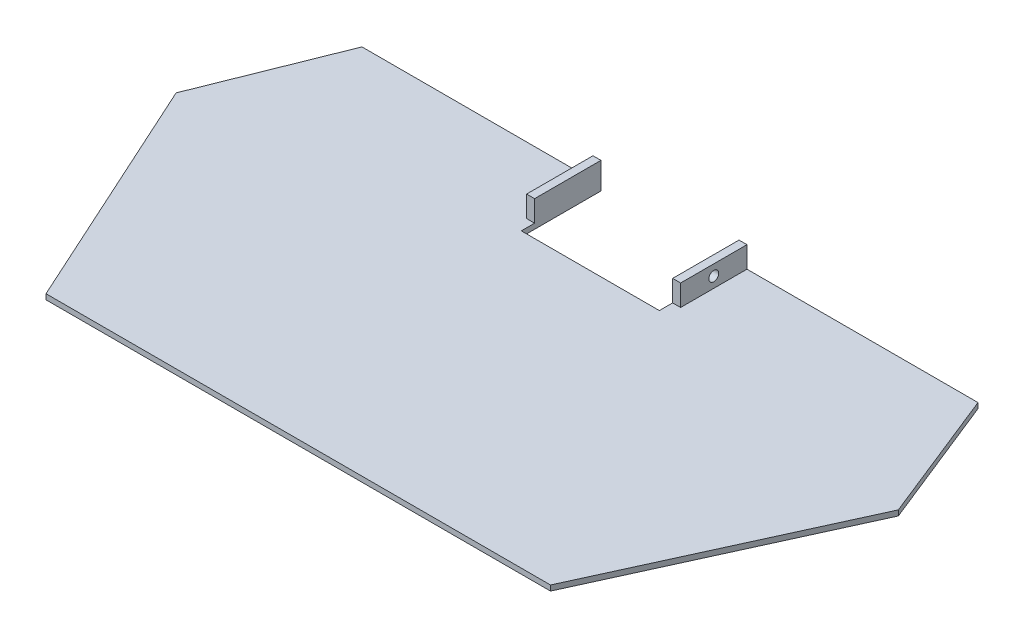
ISO-10303-21;
HEADER;
FILE_DESCRIPTION(('STEP AP214'),'2;1');
FILE_NAME('part.step','',(''),(''),'','','');
FILE_SCHEMA(('AUTOMOTIVE_DESIGN { 1 0 10303 214 1 1 1 1 }'));
ENDSEC;
DATA;
#1=APPLICATION_CONTEXT('core data for automotive mechanical design processes');
#2=APPLICATION_PROTOCOL_DEFINITION('international standard','automotive_design',2000,#1);
#3=PRODUCT_CONTEXT('',#1,'mechanical');
#4=PRODUCT('Part','Part','',(#3));
#5=PRODUCT_RELATED_PRODUCT_CATEGORY('part','',(#4));
#6=PRODUCT_DEFINITION_FORMATION('','',#4);
#7=PRODUCT_DEFINITION_CONTEXT('part definition',#1,'design');
#8=PRODUCT_DEFINITION('design','',#6,#7);
#9=PRODUCT_DEFINITION_SHAPE('','',#8);
#10=(LENGTH_UNIT() NAMED_UNIT(*) SI_UNIT(.MILLI.,.METRE.));
#11=(NAMED_UNIT(*) PLANE_ANGLE_UNIT() SI_UNIT($,.RADIAN.));
#12=(NAMED_UNIT(*) SI_UNIT($,.STERADIAN.) SOLID_ANGLE_UNIT());
#13=UNCERTAINTY_MEASURE_WITH_UNIT(LENGTH_MEASURE(1.E-05),#10,'distance_accuracy_value','');
#14=(GEOMETRIC_REPRESENTATION_CONTEXT(3) GLOBAL_UNCERTAINTY_ASSIGNED_CONTEXT((#13)) GLOBAL_UNIT_ASSIGNED_CONTEXT((#10,
#11,#12)) REPRESENTATION_CONTEXT('',''));
#15=CARTESIAN_POINT('',(0.,0.,0.));
#16=DIRECTION('',(0.,0.,1.));
#17=DIRECTION('',(1.,0.,0.));
#18=AXIS2_PLACEMENT_3D('',#15,#16,#17);
#19=CARTESIAN_POINT('',(0.,2.,0.));
#20=DIRECTION('',(0.,1.,0.));
#21=DIRECTION('',(0.,0.,1.));
#22=AXIS2_PLACEMENT_3D('',#19,#20,#21);
#23=PLANE('',#22);
#24=DIRECTION('',(0.,0.,-1.));
#25=VECTOR('',#24,1.);
#26=CARTESIAN_POINT('',(29.,2.,-60.));
#27=LINE('',#26,#25);
#28=CARTESIAN_POINT('',(29.,2.,-35.));
#29=VERTEX_POINT('',#28);
#30=CARTESIAN_POINT('',(29.,2.,-60.));
#31=VERTEX_POINT('',#30);
#32=EDGE_CURVE('E153',#29,#31,#27,.T.);
#33=ORIENTED_EDGE('',*,*,#32,.F.);
#34=DIRECTION('',(1.,0.,0.));
#35=VECTOR('',#34,1.);
#36=CARTESIAN_POINT('',(26.,2.,-35.));
#37=LINE('',#36,#35);
#38=CARTESIAN_POINT('',(26.,2.,-35.));
#39=VERTEX_POINT('',#38);
#40=EDGE_CURVE('E160',#39,#29,#37,.T.);
#41=ORIENTED_EDGE('',*,*,#40,.F.);
#42=DIRECTION('',(0.,0.,1.));
#43=VECTOR('',#42,1.);
#44=CARTESIAN_POINT('',(26.,2.,-30.));
#45=LINE('',#44,#43);
#46=CARTESIAN_POINT('',(26.,2.,-30.));
#47=VERTEX_POINT('',#46);
#48=EDGE_CURVE('E173',#39,#47,#45,.T.);
#49=ORIENTED_EDGE('',*,*,#48,.T.);
#50=DIRECTION('',(-1.,0.,0.));
#51=VECTOR('',#50,1.);
#52=CARTESIAN_POINT('',(26.,2.,-30.));
#53=LINE('',#52,#51);
#54=CARTESIAN_POINT('',(-26.,2.,-30.));
#55=VERTEX_POINT('',#54);
#56=EDGE_CURVE('E175',#47,#55,#53,.T.);
#57=ORIENTED_EDGE('',*,*,#56,.T.);
#58=DIRECTION('',(0.,0.,-1.));
#59=VECTOR('',#58,1.);
#60=CARTESIAN_POINT('',(-26.,2.,-30.));
#61=LINE('',#60,#59);
#62=CARTESIAN_POINT('',(-26.,2.,-35.));
#63=VERTEX_POINT('',#62);
#64=EDGE_CURVE('E182',#55,#63,#61,.T.);
#65=ORIENTED_EDGE('',*,*,#64,.T.);
#66=DIRECTION('',(1.,0.,0.));
#67=VECTOR('',#66,1.);
#68=CARTESIAN_POINT('',(-26.,2.,-35.));
#69=LINE('',#68,#67);
#70=CARTESIAN_POINT('',(-29.,2.,-35.));
#71=VERTEX_POINT('',#70);
#72=EDGE_CURVE('E265',#71,#63,#69,.T.);
#73=ORIENTED_EDGE('',*,*,#72,.F.);
#74=DIRECTION('',(0.,0.,1.));
#75=VECTOR('',#74,1.);
#76=CARTESIAN_POINT('',(-29.,2.,-60.));
#77=LINE('',#76,#75);
#78=CARTESIAN_POINT('',(-29.,2.,-60.));
#79=VERTEX_POINT('',#78);
#80=EDGE_CURVE('E63',#79,#71,#77,.T.);
#81=ORIENTED_EDGE('',*,*,#80,.F.);
#82=DIRECTION('',(-1.,0.,0.));
#83=VECTOR('',#82,1.);
#84=CARTESIAN_POINT('',(-26.,2.,-60.));
#85=LINE('',#84,#83);
#86=CARTESIAN_POINT('',(-116.,2.,-60.));
#87=VERTEX_POINT('',#86);
#88=EDGE_CURVE('E184',#79,#87,#85,.T.);
#89=ORIENTED_EDGE('',*,*,#88,.T.);
#90=DIRECTION('',(-0.371390676354104,0.,0.928476690885259));
#91=VECTOR('',#90,1.);
#92=CARTESIAN_POINT('',(-116.,2.,-60.));
#93=LINE('',#92,#91);
#94=CARTESIAN_POINT('',(-136.,2.,-9.99999999999998));
#95=VERTEX_POINT('',#94);
#96=EDGE_CURVE('E186',#87,#95,#93,.T.);
#97=ORIENTED_EDGE('',*,*,#96,.T.);
#98=DIRECTION('',(0.414564612099926,0.,0.910019880219349));
#99=VECTOR('',#98,1.);
#100=CARTESIAN_POINT('',(-136.,2.,-9.99999999999998));
#101=LINE('',#100,#99);
#102=CARTESIAN_POINT('',(-95.,2.,80.));
#103=VERTEX_POINT('',#102);
#104=EDGE_CURVE('E188',#95,#103,#101,.T.);
#105=ORIENTED_EDGE('',*,*,#104,.T.);
#106=DIRECTION('',(1.,0.,0.));
#107=VECTOR('',#106,1.);
#108=CARTESIAN_POINT('',(-95.,2.,80.));
#109=LINE('',#108,#107);
#110=CARTESIAN_POINT('',(95.,2.,80.));
#111=VERTEX_POINT('',#110);
#112=EDGE_CURVE('E190',#103,#111,#109,.T.);
#113=ORIENTED_EDGE('',*,*,#112,.T.);
#114=DIRECTION('',(0.414564612099925,0.,-0.910019880219349));
#115=VECTOR('',#114,1.);
#116=CARTESIAN_POINT('',(136.,2.,-10.));
#117=LINE('',#116,#115);
#118=CARTESIAN_POINT('',(136.,2.,-10.));
#119=VERTEX_POINT('',#118);
#120=EDGE_CURVE('E192',#111,#119,#117,.T.);
#121=ORIENTED_EDGE('',*,*,#120,.T.);
#122=DIRECTION('',(-0.371390676354104,0.,-0.928476690885259));
#123=VECTOR('',#122,1.);
#124=CARTESIAN_POINT('',(116.,2.,-60.));
#125=LINE('',#124,#123);
#126=CARTESIAN_POINT('',(116.,2.,-60.));
#127=VERTEX_POINT('',#126);
#128=EDGE_CURVE('E171',#119,#127,#125,.T.);
#129=ORIENTED_EDGE('',*,*,#128,.T.);
#130=DIRECTION('',(-1.,0.,0.));
#131=VECTOR('',#130,1.);
#132=CARTESIAN_POINT('',(26.,2.,-60.));
#133=LINE('',#132,#131);
#134=EDGE_CURVE('E165',#127,#31,#133,.T.);
#135=ORIENTED_EDGE('',*,*,#134,.T.);
#136=EDGE_LOOP('',(#33,#41,#49,#57,#65,#73,#81,#89,#97,#105,#113,#121,#129,#135));
#137=FACE_BOUND('',#136,.T.);
#138=ADVANCED_FACE('F39',(#137),#23,.T.);
#139=CARTESIAN_POINT('',(116.,2.,-60.));
#140=DIRECTION('',(-0.928476690885259,0.,0.371390676354104));
#141=DIRECTION('',(0.371390676354104,0.,0.928476690885259));
#142=AXIS2_PLACEMENT_3D('',#139,#140,#141);
#143=PLANE('',#142);
#144=DIRECTION('',(-0.371390676354104,0.,-0.928476690885259));
#145=VECTOR('',#144,1.);
#146=CARTESIAN_POINT('',(116.,0.,-60.));
#147=LINE('',#146,#145);
#148=CARTESIAN_POINT('',(136.,0.,-10.));
#149=VERTEX_POINT('',#148);
#150=CARTESIAN_POINT('',(116.,0.,-60.));
#151=VERTEX_POINT('',#150);
#152=EDGE_CURVE('E195',#149,#151,#147,.T.);
#153=ORIENTED_EDGE('',*,*,#152,.T.);
#154=DIRECTION('',(0.,-1.,0.));
#155=VECTOR('',#154,1.);
#156=CARTESIAN_POINT('',(116.,2.,-60.));
#157=LINE('',#156,#155);
#158=EDGE_CURVE('E11',#127,#151,#157,.T.);
#159=ORIENTED_EDGE('',*,*,#158,.F.);
#160=ORIENTED_EDGE('',*,*,#128,.F.);
#161=DIRECTION('',(0.,-1.,0.));
#162=VECTOR('',#161,1.);
#163=CARTESIAN_POINT('',(136.,2.,-10.));
#164=LINE('',#163,#162);
#165=EDGE_CURVE('E194',#119,#149,#164,.T.);
#166=ORIENTED_EDGE('',*,*,#165,.T.);
#167=EDGE_LOOP('',(#153,#159,#160,#166));
#168=FACE_BOUND('',#167,.T.);
#169=ADVANCED_FACE('F41',(#168),#143,.F.);
#170=CARTESIAN_POINT('',(26.,2.,-60.));
#171=DIRECTION('',(0.,0.,1.));
#172=DIRECTION('',(1.,0.,0.));
#173=AXIS2_PLACEMENT_3D('',#170,#171,#172);
#174=PLANE('',#173);
#175=DIRECTION('',(-1.,0.,0.));
#176=VECTOR('',#175,1.);
#177=CARTESIAN_POINT('',(26.,0.,-60.));
#178=LINE('',#177,#176);
#179=CARTESIAN_POINT('',(26.,0.,-60.));
#180=VERTEX_POINT('',#179);
#181=EDGE_CURVE('E198',#151,#180,#178,.T.);
#182=ORIENTED_EDGE('',*,*,#181,.T.);
#183=DIRECTION('',(0.,-1.,0.));
#184=VECTOR('',#183,1.);
#185=CARTESIAN_POINT('',(26.,2.,-60.));
#186=LINE('',#185,#184);
#187=CARTESIAN_POINT('',(26.,10.,-60.));
#188=VERTEX_POINT('',#187);
#189=EDGE_CURVE('E48',#188,#180,#186,.T.);
#190=ORIENTED_EDGE('',*,*,#189,.F.);
#191=DIRECTION('',(-1.,0.,0.));
#192=VECTOR('',#191,1.);
#193=CARTESIAN_POINT('',(26.,10.,-60.));
#194=LINE('',#193,#192);
#195=CARTESIAN_POINT('',(29.,10.,-60.));
#196=VERTEX_POINT('',#195);
#197=EDGE_CURVE('E161',#196,#188,#194,.T.);
#198=ORIENTED_EDGE('',*,*,#197,.F.);
#199=DIRECTION('',(0.,-1.,0.));
#200=VECTOR('',#199,1.);
#201=CARTESIAN_POINT('',(29.,10.,-60.));
#202=LINE('',#201,#200);
#203=EDGE_CURVE('E156',#196,#31,#202,.T.);
#204=ORIENTED_EDGE('',*,*,#203,.T.);
#205=ORIENTED_EDGE('',*,*,#134,.F.);
#206=ORIENTED_EDGE('',*,*,#158,.T.);
#207=EDGE_LOOP('',(#182,#190,#198,#204,#205,#206));
#208=FACE_BOUND('',#207,.T.);
#209=ADVANCED_FACE('F164',(#208),#174,.F.);
#210=CARTESIAN_POINT('',(26.,2.,-30.));
#211=DIRECTION('',(1.,0.,0.));
#212=DIRECTION('',(0.,0.,-1.));
#213=AXIS2_PLACEMENT_3D('',#210,#211,#212);
#214=PLANE('',#213);
#215=CARTESIAN_POINT('',(26.,6.,-47.5));
#216=DIRECTION('',(-1.,0.,0.));
#217=DIRECTION('',(0.,0.,1.));
#218=AXIS2_PLACEMENT_3D('',#215,#216,#217);
#219=CIRCLE('',#218,1.85);
#220=CARTESIAN_POINT('',(26.,6.,-45.65));
#221=VERTEX_POINT('',#220);
#222=EDGE_CURVE('E327',#221,#221,#219,.T.);
#223=ORIENTED_EDGE('',*,*,#222,.F.);
#224=EDGE_LOOP('',(#223));
#225=FACE_BOUND('',#224,.T.);
#226=DIRECTION('',(0.,0.,1.));
#227=VECTOR('',#226,1.);
#228=CARTESIAN_POINT('',(26.,0.,-30.));
#229=LINE('',#228,#227);
#230=CARTESIAN_POINT('',(26.,0.,-30.));
#231=VERTEX_POINT('',#230);
#232=EDGE_CURVE('E201',#180,#231,#229,.T.);
#233=ORIENTED_EDGE('',*,*,#232,.T.);
#234=DIRECTION('',(0.,-1.,0.));
#235=VECTOR('',#234,1.);
#236=CARTESIAN_POINT('',(26.,2.,-30.));
#237=LINE('',#236,#235);
#238=EDGE_CURVE('E236',#47,#231,#237,.T.);
#239=ORIENTED_EDGE('',*,*,#238,.F.);
#240=ORIENTED_EDGE('',*,*,#48,.F.);
#241=DIRECTION('',(0.,-1.,0.));
#242=VECTOR('',#241,1.);
#243=CARTESIAN_POINT('',(26.,10.,-35.));
#244=LINE('',#243,#242);
#245=CARTESIAN_POINT('',(26.,10.,-35.));
#246=VERTEX_POINT('',#245);
#247=EDGE_CURVE('E325',#246,#39,#244,.T.);
#248=ORIENTED_EDGE('',*,*,#247,.F.);
#249=DIRECTION('',(0.,0.,1.));
#250=VECTOR('',#249,1.);
#251=CARTESIAN_POINT('',(26.,10.,-60.));
#252=LINE('',#251,#250);
#253=EDGE_CURVE('E246',#188,#246,#252,.T.);
#254=ORIENTED_EDGE('',*,*,#253,.F.);
#255=ORIENTED_EDGE('',*,*,#189,.T.);
#256=EDGE_LOOP('',(#233,#239,#240,#248,#254,#255));
#257=FACE_BOUND('',#256,.T.);
#258=ADVANCED_FACE('F243',(#225,#257),#214,.F.);
#259=CARTESIAN_POINT('',(26.,2.,-30.));
#260=DIRECTION('',(0.,0.,1.));
#261=DIRECTION('',(1.,0.,0.));
#262=AXIS2_PLACEMENT_3D('',#259,#260,#261);
#263=PLANE('',#262);
#264=DIRECTION('',(-1.,0.,0.));
#265=VECTOR('',#264,1.);
#266=CARTESIAN_POINT('',(26.,0.,-30.));
#267=LINE('',#266,#265);
#268=CARTESIAN_POINT('',(-26.,0.,-30.));
#269=VERTEX_POINT('',#268);
#270=EDGE_CURVE('E203',#231,#269,#267,.T.);
#271=ORIENTED_EDGE('',*,*,#270,.T.);
#272=DIRECTION('',(0.,-1.,0.));
#273=VECTOR('',#272,1.);
#274=CARTESIAN_POINT('',(-26.,2.,-30.));
#275=LINE('',#274,#273);
#276=EDGE_CURVE('E233',#55,#269,#275,.T.);
#277=ORIENTED_EDGE('',*,*,#276,.F.);
#278=ORIENTED_EDGE('',*,*,#56,.F.);
#279=ORIENTED_EDGE('',*,*,#238,.T.);
#280=EDGE_LOOP('',(#271,#277,#278,#279));
#281=FACE_BOUND('',#280,.T.);
#282=ADVANCED_FACE('F255',(#281),#263,.F.);
#283=CARTESIAN_POINT('',(-26.,2.,-30.));
#284=DIRECTION('',(-1.,0.,0.));
#285=DIRECTION('',(0.,0.,1.));
#286=AXIS2_PLACEMENT_3D('',#283,#284,#285);
#287=PLANE('',#286);
#288=DIRECTION('',(0.,0.,-1.));
#289=VECTOR('',#288,1.);
#290=CARTESIAN_POINT('',(-26.,0.,-30.));
#291=LINE('',#290,#289);
#292=CARTESIAN_POINT('',(-26.,0.,-60.));
#293=VERTEX_POINT('',#292);
#294=EDGE_CURVE('E205',#269,#293,#291,.T.);
#295=ORIENTED_EDGE('',*,*,#294,.T.);
#296=DIRECTION('',(0.,-1.,0.));
#297=VECTOR('',#296,1.);
#298=CARTESIAN_POINT('',(-26.,2.,-60.));
#299=LINE('',#298,#297);
#300=CARTESIAN_POINT('',(-26.,10.,-60.));
#301=VERTEX_POINT('',#300);
#302=EDGE_CURVE('E230',#301,#293,#299,.T.);
#303=ORIENTED_EDGE('',*,*,#302,.F.);
#304=DIRECTION('',(0.,0.,-1.));
#305=VECTOR('',#304,1.);
#306=CARTESIAN_POINT('',(-26.,10.,-60.));
#307=LINE('',#306,#305);
#308=CARTESIAN_POINT('',(-26.,10.,-35.));
#309=VERTEX_POINT('',#308);
#310=EDGE_CURVE('E272',#309,#301,#307,.T.);
#311=ORIENTED_EDGE('',*,*,#310,.F.);
#312=DIRECTION('',(0.,-1.,0.));
#313=VECTOR('',#312,1.);
#314=CARTESIAN_POINT('',(-26.,10.,-35.));
#315=LINE('',#314,#313);
#316=EDGE_CURVE('E263',#309,#63,#315,.T.);
#317=ORIENTED_EDGE('',*,*,#316,.T.);
#318=ORIENTED_EDGE('',*,*,#64,.F.);
#319=ORIENTED_EDGE('',*,*,#276,.T.);
#320=EDGE_LOOP('',(#295,#303,#311,#317,#318,#319));
#321=FACE_BOUND('',#320,.T.);
#322=ADVANCED_FACE('F259',(#321),#287,.F.);
#323=CARTESIAN_POINT('',(-26.,2.,-60.));
#324=DIRECTION('',(0.,0.,1.));
#325=DIRECTION('',(1.,0.,0.));
#326=AXIS2_PLACEMENT_3D('',#323,#324,#325);
#327=PLANE('',#326);
#328=DIRECTION('',(-1.,0.,0.));
#329=VECTOR('',#328,1.);
#330=CARTESIAN_POINT('',(-26.,0.,-60.));
#331=LINE('',#330,#329);
#332=CARTESIAN_POINT('',(-116.,0.,-60.));
#333=VERTEX_POINT('',#332);
#334=EDGE_CURVE('E207',#293,#333,#331,.T.);
#335=ORIENTED_EDGE('',*,*,#334,.T.);
#336=DIRECTION('',(0.,-1.,0.));
#337=VECTOR('',#336,1.);
#338=CARTESIAN_POINT('',(-116.,2.,-60.));
#339=LINE('',#338,#337);
#340=EDGE_CURVE('E227',#87,#333,#339,.T.);
#341=ORIENTED_EDGE('',*,*,#340,.F.);
#342=ORIENTED_EDGE('',*,*,#88,.F.);
#343=DIRECTION('',(0.,-1.,0.));
#344=VECTOR('',#343,1.);
#345=CARTESIAN_POINT('',(-29.,10.,-60.));
#346=LINE('',#345,#344);
#347=CARTESIAN_POINT('',(-29.,10.,-60.));
#348=VERTEX_POINT('',#347);
#349=EDGE_CURVE('E199',#348,#79,#346,.T.);
#350=ORIENTED_EDGE('',*,*,#349,.F.);
#351=DIRECTION('',(-1.,0.,0.));
#352=VECTOR('',#351,1.);
#353=CARTESIAN_POINT('',(-26.,10.,-60.));
#354=LINE('',#353,#352);
#355=EDGE_CURVE('E275',#301,#348,#354,.T.);
#356=ORIENTED_EDGE('',*,*,#355,.F.);
#357=ORIENTED_EDGE('',*,*,#302,.T.);
#358=EDGE_LOOP('',(#335,#341,#342,#350,#356,#357));
#359=FACE_BOUND('',#358,.T.);
#360=ADVANCED_FACE('F290',(#359),#327,.F.);
#361=CARTESIAN_POINT('',(-116.,2.,-60.));
#362=DIRECTION('',(0.928476690885259,0.,0.371390676354104));
#363=DIRECTION('',(0.371390676354104,0.,-0.928476690885259));
#364=AXIS2_PLACEMENT_3D('',#361,#362,#363);
#365=PLANE('',#364);
#366=DIRECTION('',(-0.371390676354104,0.,0.928476690885259));
#367=VECTOR('',#366,1.);
#368=CARTESIAN_POINT('',(-116.,0.,-60.));
#369=LINE('',#368,#367);
#370=CARTESIAN_POINT('',(-136.,0.,-9.99999999999998));
#371=VERTEX_POINT('',#370);
#372=EDGE_CURVE('E209',#333,#371,#369,.T.);
#373=ORIENTED_EDGE('',*,*,#372,.T.);
#374=DIRECTION('',(0.,-1.,0.));
#375=VECTOR('',#374,1.);
#376=CARTESIAN_POINT('',(-136.,2.,-9.99999999999998));
#377=LINE('',#376,#375);
#378=EDGE_CURVE('E224',#95,#371,#377,.T.);
#379=ORIENTED_EDGE('',*,*,#378,.F.);
#380=ORIENTED_EDGE('',*,*,#96,.F.);
#381=ORIENTED_EDGE('',*,*,#340,.T.);
#382=EDGE_LOOP('',(#373,#379,#380,#381));
#383=FACE_BOUND('',#382,.T.);
#384=ADVANCED_FACE('F297',(#383),#365,.F.);
#385=CARTESIAN_POINT('',(-136.,2.,-9.99999999999998));
#386=DIRECTION('',(0.910019880219349,0.,-0.414564612099926));
#387=DIRECTION('',(-0.414564612099926,0.,-0.910019880219349));
#388=AXIS2_PLACEMENT_3D('',#385,#386,#387);
#389=PLANE('',#388);
#390=DIRECTION('',(0.414564612099926,0.,0.910019880219349));
#391=VECTOR('',#390,1.);
#392=CARTESIAN_POINT('',(-136.,0.,-9.99999999999998));
#393=LINE('',#392,#391);
#394=CARTESIAN_POINT('',(-95.,0.,80.));
#395=VERTEX_POINT('',#394);
#396=EDGE_CURVE('E211',#371,#395,#393,.T.);
#397=ORIENTED_EDGE('',*,*,#396,.T.);
#398=DIRECTION('',(0.,-1.,0.));
#399=VECTOR('',#398,1.);
#400=CARTESIAN_POINT('',(-95.,2.,80.));
#401=LINE('',#400,#399);
#402=EDGE_CURVE('E221',#103,#395,#401,.T.);
#403=ORIENTED_EDGE('',*,*,#402,.F.);
#404=ORIENTED_EDGE('',*,*,#104,.F.);
#405=ORIENTED_EDGE('',*,*,#378,.T.);
#406=EDGE_LOOP('',(#397,#403,#404,#405));
#407=FACE_BOUND('',#406,.T.);
#408=ADVANCED_FACE('F301',(#407),#389,.F.);
#409=CARTESIAN_POINT('',(-95.,2.,80.));
#410=DIRECTION('',(0.,0.,-1.));
#411=DIRECTION('',(-1.,0.,0.));
#412=AXIS2_PLACEMENT_3D('',#409,#410,#411);
#413=PLANE('',#412);
#414=DIRECTION('',(1.,0.,0.));
#415=VECTOR('',#414,1.);
#416=CARTESIAN_POINT('',(-95.,0.,80.));
#417=LINE('',#416,#415);
#418=CARTESIAN_POINT('',(95.,0.,80.));
#419=VERTEX_POINT('',#418);
#420=EDGE_CURVE('E213',#395,#419,#417,.T.);
#421=ORIENTED_EDGE('',*,*,#420,.T.);
#422=DIRECTION('',(0.,-1.,0.));
#423=VECTOR('',#422,1.);
#424=CARTESIAN_POINT('',(95.,2.,80.));
#425=LINE('',#424,#423);
#426=EDGE_CURVE('E218',#111,#419,#425,.T.);
#427=ORIENTED_EDGE('',*,*,#426,.F.);
#428=ORIENTED_EDGE('',*,*,#112,.F.);
#429=ORIENTED_EDGE('',*,*,#402,.T.);
#430=EDGE_LOOP('',(#421,#427,#428,#429));
#431=FACE_BOUND('',#430,.T.);
#432=ADVANCED_FACE('F306',(#431),#413,.F.);
#433=CARTESIAN_POINT('',(136.,2.,-10.));
#434=DIRECTION('',(-0.910019880219349,0.,-0.414564612099925));
#435=DIRECTION('',(-0.414564612099925,0.,0.910019880219349));
#436=AXIS2_PLACEMENT_3D('',#433,#434,#435);
#437=PLANE('',#436);
#438=DIRECTION('',(0.414564612099925,0.,-0.910019880219349));
#439=VECTOR('',#438,1.);
#440=CARTESIAN_POINT('',(136.,0.,-10.));
#441=LINE('',#440,#439);
#442=EDGE_CURVE('E177',#419,#149,#441,.T.);
#443=ORIENTED_EDGE('',*,*,#442,.T.);
#444=ORIENTED_EDGE('',*,*,#165,.F.);
#445=ORIENTED_EDGE('',*,*,#120,.F.);
#446=ORIENTED_EDGE('',*,*,#426,.T.);
#447=EDGE_LOOP('',(#443,#444,#445,#446));
#448=FACE_BOUND('',#447,.T.);
#449=ADVANCED_FACE('F310',(#448),#437,.F.);
#450=CARTESIAN_POINT('',(0.,0.,0.));
#451=DIRECTION('',(0.,1.,0.));
#452=DIRECTION('',(0.,0.,1.));
#453=AXIS2_PLACEMENT_3D('',#450,#451,#452);
#454=PLANE('',#453);
#455=ORIENTED_EDGE('',*,*,#152,.F.);
#456=ORIENTED_EDGE('',*,*,#442,.F.);
#457=ORIENTED_EDGE('',*,*,#420,.F.);
#458=ORIENTED_EDGE('',*,*,#396,.F.);
#459=ORIENTED_EDGE('',*,*,#372,.F.);
#460=ORIENTED_EDGE('',*,*,#334,.F.);
#461=ORIENTED_EDGE('',*,*,#294,.F.);
#462=ORIENTED_EDGE('',*,*,#270,.F.);
#463=ORIENTED_EDGE('',*,*,#232,.F.);
#464=ORIENTED_EDGE('',*,*,#181,.F.);
#465=EDGE_LOOP('',(#455,#456,#457,#458,#459,#460,#461,#462,#463,#464));
#466=FACE_BOUND('',#465,.T.);
#467=ADVANCED_FACE('F250',(#466),#454,.F.);
#468=CARTESIAN_POINT('',(-29.,10.,-60.));
#469=DIRECTION('',(1.,0.,0.));
#470=DIRECTION('',(0.,0.,-1.));
#471=AXIS2_PLACEMENT_3D('',#468,#469,#470);
#472=PLANE('',#471);
#473=ORIENTED_EDGE('',*,*,#80,.T.);
#474=DIRECTION('',(0.,-1.,0.));
#475=VECTOR('',#474,1.);
#476=CARTESIAN_POINT('',(-29.,10.,-35.));
#477=LINE('',#476,#475);
#478=CARTESIAN_POINT('',(-29.,10.,-35.));
#479=VERTEX_POINT('',#478);
#480=EDGE_CURVE('E271',#479,#71,#477,.T.);
#481=ORIENTED_EDGE('',*,*,#480,.F.);
#482=DIRECTION('',(0.,0.,1.));
#483=VECTOR('',#482,1.);
#484=CARTESIAN_POINT('',(-29.,10.,-60.));
#485=LINE('',#484,#483);
#486=EDGE_CURVE('E287',#348,#479,#485,.T.);
#487=ORIENTED_EDGE('',*,*,#486,.F.);
#488=ORIENTED_EDGE('',*,*,#349,.T.);
#489=EDGE_LOOP('',(#473,#481,#487,#488));
#490=FACE_BOUND('',#489,.T.);
#491=ADVANCED_FACE('F286',(#490),#472,.F.);
#492=CARTESIAN_POINT('',(-26.,10.,-35.));
#493=DIRECTION('',(0.,0.,-1.));
#494=DIRECTION('',(-1.,0.,0.));
#495=AXIS2_PLACEMENT_3D('',#492,#493,#494);
#496=PLANE('',#495);
#497=ORIENTED_EDGE('',*,*,#72,.T.);
#498=ORIENTED_EDGE('',*,*,#316,.F.);
#499=DIRECTION('',(1.,0.,0.));
#500=VECTOR('',#499,1.);
#501=CARTESIAN_POINT('',(-26.,10.,-35.));
#502=LINE('',#501,#500);
#503=EDGE_CURVE('E281',#479,#309,#502,.T.);
#504=ORIENTED_EDGE('',*,*,#503,.F.);
#505=ORIENTED_EDGE('',*,*,#480,.T.);
#506=EDGE_LOOP('',(#497,#498,#504,#505));
#507=FACE_BOUND('',#506,.T.);
#508=ADVANCED_FACE('F268',(#507),#496,.F.);
#509=CARTESIAN_POINT('',(0.,10.,0.));
#510=DIRECTION('',(0.,-1.,0.));
#511=DIRECTION('',(0.,0.,-1.));
#512=AXIS2_PLACEMENT_3D('',#509,#510,#511);
#513=PLANE('',#512);
#514=ORIENTED_EDGE('',*,*,#310,.T.);
#515=ORIENTED_EDGE('',*,*,#355,.T.);
#516=ORIENTED_EDGE('',*,*,#486,.T.);
#517=ORIENTED_EDGE('',*,*,#503,.T.);
#518=EDGE_LOOP('',(#514,#515,#516,#517));
#519=FACE_BOUND('',#518,.T.);
#520=ADVANCED_FACE('F314',(#519),#513,.F.);
#521=CARTESIAN_POINT('',(26.,10.,-35.));
#522=DIRECTION('',(0.,0.,-1.));
#523=DIRECTION('',(-1.,0.,0.));
#524=AXIS2_PLACEMENT_3D('',#521,#522,#523);
#525=PLANE('',#524);
#526=ORIENTED_EDGE('',*,*,#40,.T.);
#527=DIRECTION('',(0.,-1.,0.));
#528=VECTOR('',#527,1.);
#529=CARTESIAN_POINT('',(29.,10.,-35.));
#530=LINE('',#529,#528);
#531=CARTESIAN_POINT('',(29.,10.,-35.));
#532=VERTEX_POINT('',#531);
#533=EDGE_CURVE('E55',#532,#29,#530,.T.);
#534=ORIENTED_EDGE('',*,*,#533,.F.);
#535=DIRECTION('',(1.,0.,0.));
#536=VECTOR('',#535,1.);
#537=CARTESIAN_POINT('',(26.,10.,-35.));
#538=LINE('',#537,#536);
#539=EDGE_CURVE('E320',#246,#532,#538,.T.);
#540=ORIENTED_EDGE('',*,*,#539,.F.);
#541=ORIENTED_EDGE('',*,*,#247,.T.);
#542=EDGE_LOOP('',(#526,#534,#540,#541));
#543=FACE_BOUND('',#542,.T.);
#544=ADVANCED_FACE('F430',(#543),#525,.F.);
#545=CARTESIAN_POINT('',(29.,10.,-60.));
#546=DIRECTION('',(-1.,0.,0.));
#547=DIRECTION('',(0.,0.,1.));
#548=AXIS2_PLACEMENT_3D('',#545,#546,#547);
#549=PLANE('',#548);
#550=CARTESIAN_POINT('',(29.,6.,-47.5));
#551=DIRECTION('',(-1.,0.,0.));
#552=DIRECTION('',(0.,0.,1.));
#553=AXIS2_PLACEMENT_3D('',#550,#551,#552);
#554=CIRCLE('',#553,1.85);
#555=CARTESIAN_POINT('',(29.,6.,-45.65));
#556=VERTEX_POINT('',#555);
#557=EDGE_CURVE('E43',#556,#556,#554,.T.);
#558=ORIENTED_EDGE('',*,*,#557,.T.);
#559=EDGE_LOOP('',(#558));
#560=FACE_BOUND('',#559,.T.);
#561=ORIENTED_EDGE('',*,*,#32,.T.);
#562=ORIENTED_EDGE('',*,*,#203,.F.);
#563=DIRECTION('',(0.,0.,-1.));
#564=VECTOR('',#563,1.);
#565=CARTESIAN_POINT('',(29.,10.,-60.));
#566=LINE('',#565,#564);
#567=EDGE_CURVE('E168',#532,#196,#566,.T.);
#568=ORIENTED_EDGE('',*,*,#567,.F.);
#569=ORIENTED_EDGE('',*,*,#533,.T.);
#570=EDGE_LOOP('',(#561,#562,#568,#569));
#571=FACE_BOUND('',#570,.T.);
#572=ADVANCED_FACE('F155',(#560,#571),#549,.F.);
#573=CARTESIAN_POINT('',(0.,10.,0.));
#574=DIRECTION('',(0.,-1.,0.));
#575=DIRECTION('',(0.,0.,-1.));
#576=AXIS2_PLACEMENT_3D('',#573,#574,#575);
#577=PLANE('',#576);
#578=ORIENTED_EDGE('',*,*,#197,.T.);
#579=ORIENTED_EDGE('',*,*,#253,.T.);
#580=ORIENTED_EDGE('',*,*,#539,.T.);
#581=ORIENTED_EDGE('',*,*,#567,.T.);
#582=EDGE_LOOP('',(#578,#579,#580,#581));
#583=FACE_BOUND('',#582,.T.);
#584=ADVANCED_FACE('F337',(#583),#577,.F.);
#585=CARTESIAN_POINT('',(34.,6.,-47.5));
#586=DIRECTION('',(-1.,0.,0.));
#587=DIRECTION('',(0.,0.,1.));
#588=AXIS2_PLACEMENT_3D('',#585,#586,#587);
#589=CYLINDRICAL_SURFACE('',#588,1.85);
#590=ORIENTED_EDGE('',*,*,#222,.T.);
#591=EDGE_LOOP('',(#590));
#592=FACE_BOUND('',#591,.T.);
#593=ORIENTED_EDGE('',*,*,#557,.F.);
#594=EDGE_LOOP('',(#593));
#595=FACE_BOUND('',#594,.T.);
#596=ADVANCED_FACE('F335',(#592,#595),#589,.F.);
#597=CLOSED_SHELL('',(#138,#169,#209,#258,#282,#322,#360,#384,#408,#432,#449,#467,#491,#508,
#520,#544,#572,#584,#596));
#598=MANIFOLD_SOLID_BREP('B2',#597);
#599=ADVANCED_BREP_SHAPE_REPRESENTATION('',(#18,#598),#14);
#600=SHAPE_DEFINITION_REPRESENTATION(#9,#599);
ENDSEC;
END-ISO-10303-21;
